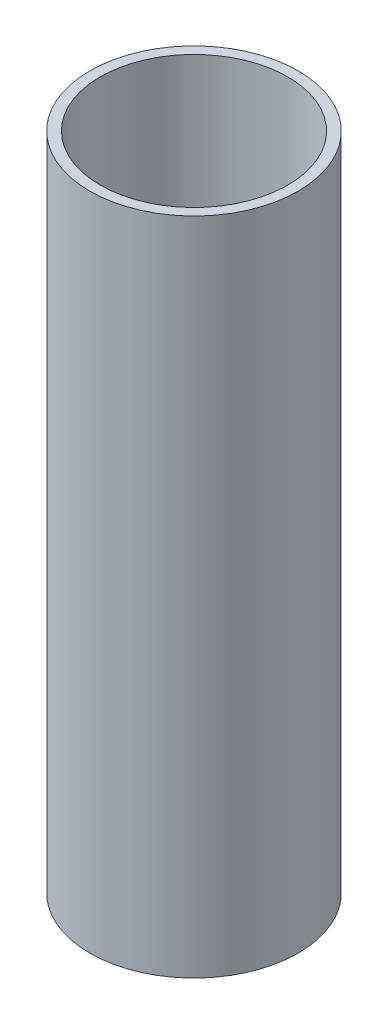
ISO-10303-21;
HEADER;
FILE_DESCRIPTION(('STEP AP214'),'2;1');
FILE_NAME('part.step','',(''),(''),'','','');
FILE_SCHEMA(('AUTOMOTIVE_DESIGN { 1 0 10303 214 1 1 1 1 }'));
ENDSEC;
DATA;
#1=APPLICATION_CONTEXT('core data for automotive mechanical design processes');
#2=APPLICATION_PROTOCOL_DEFINITION('international standard','automotive_design',2000,#1);
#3=PRODUCT_CONTEXT('',#1,'mechanical');
#4=PRODUCT('Part','Part','',(#3));
#5=PRODUCT_RELATED_PRODUCT_CATEGORY('part','',(#4));
#6=PRODUCT_DEFINITION_FORMATION('','',#4);
#7=PRODUCT_DEFINITION_CONTEXT('part definition',#1,'design');
#8=PRODUCT_DEFINITION('design','',#6,#7);
#9=PRODUCT_DEFINITION_SHAPE('','',#8);
#10=(LENGTH_UNIT() NAMED_UNIT(*) SI_UNIT(.MILLI.,.METRE.));
#11=(NAMED_UNIT(*) PLANE_ANGLE_UNIT() SI_UNIT($,.RADIAN.));
#12=(NAMED_UNIT(*) SI_UNIT($,.STERADIAN.) SOLID_ANGLE_UNIT());
#13=UNCERTAINTY_MEASURE_WITH_UNIT(LENGTH_MEASURE(1.E-05),#10,'distance_accuracy_value','');
#14=(GEOMETRIC_REPRESENTATION_CONTEXT(3) GLOBAL_UNCERTAINTY_ASSIGNED_CONTEXT((#13)) GLOBAL_UNIT_ASSIGNED_CONTEXT((#10,
#11,#12)) REPRESENTATION_CONTEXT('',''));
#15=CARTESIAN_POINT('',(0.,0.,0.));
#16=DIRECTION('',(0.,0.,1.));
#17=DIRECTION('',(1.,0.,0.));
#18=AXIS2_PLACEMENT_3D('',#15,#16,#17);
#19=CARTESIAN_POINT('',(0.,190.,0.));
#20=DIRECTION('',(0.,1.,0.));
#21=DIRECTION('',(0.,0.,1.));
#22=AXIS2_PLACEMENT_3D('',#19,#20,#21);
#23=PLANE('',#22);
#24=CARTESIAN_POINT('',(0.,190.,0.));
#25=DIRECTION('',(0.,1.,0.));
#26=DIRECTION('',(0.,0.,1.));
#27=AXIS2_PLACEMENT_3D('',#24,#25,#26);
#28=CIRCLE('',#27,30.);
#29=CARTESIAN_POINT('',(0.,190.,30.));
#30=VERTEX_POINT('',#29);
#31=EDGE_CURVE('E10',#30,#30,#28,.T.);
#32=ORIENTED_EDGE('',*,*,#31,.T.);
#33=EDGE_LOOP('',(#32));
#34=FACE_BOUND('',#33,.T.);
#35=CARTESIAN_POINT('',(0.,190.,0.));
#36=DIRECTION('',(0.,1.,0.));
#37=DIRECTION('',(0.,0.,1.));
#38=AXIS2_PLACEMENT_3D('',#35,#36,#37);
#39=CIRCLE('',#38,27.);
#40=CARTESIAN_POINT('',(0.,190.,27.));
#41=VERTEX_POINT('',#40);
#42=EDGE_CURVE('E46',#41,#41,#39,.T.);
#43=ORIENTED_EDGE('',*,*,#42,.F.);
#44=EDGE_LOOP('',(#43));
#45=FACE_BOUND('',#44,.T.);
#46=ADVANCED_FACE('F35',(#34,#45),#23,.T.);
#47=CARTESIAN_POINT('',(0.,0.,0.));
#48=DIRECTION('',(0.,1.,0.));
#49=DIRECTION('',(0.,0.,1.));
#50=AXIS2_PLACEMENT_3D('',#47,#48,#49);
#51=PLANE('',#50);
#52=CARTESIAN_POINT('',(0.,0.,0.));
#53=DIRECTION('',(0.,1.,0.));
#54=DIRECTION('',(0.,0.,1.));
#55=AXIS2_PLACEMENT_3D('',#52,#53,#54);
#56=CIRCLE('',#55,30.);
#57=CARTESIAN_POINT('',(0.,0.,30.));
#58=VERTEX_POINT('',#57);
#59=EDGE_CURVE('E39',#58,#58,#56,.T.);
#60=ORIENTED_EDGE('',*,*,#59,.F.);
#61=EDGE_LOOP('',(#60));
#62=FACE_BOUND('',#61,.T.);
#63=CARTESIAN_POINT('',(0.,0.,0.));
#64=DIRECTION('',(0.,1.,0.));
#65=DIRECTION('',(0.,0.,1.));
#66=AXIS2_PLACEMENT_3D('',#63,#64,#65);
#67=CIRCLE('',#66,27.);
#68=CARTESIAN_POINT('',(0.,0.,27.));
#69=VERTEX_POINT('',#68);
#70=EDGE_CURVE('E48',#69,#69,#67,.T.);
#71=ORIENTED_EDGE('',*,*,#70,.T.);
#72=EDGE_LOOP('',(#71));
#73=FACE_BOUND('',#72,.T.);
#74=ADVANCED_FACE('F58',(#62,#73),#51,.F.);
#75=CARTESIAN_POINT('',(0.,190.,0.));
#76=DIRECTION('',(0.,-1.,0.));
#77=DIRECTION('',(0.,0.,-1.));
#78=AXIS2_PLACEMENT_3D('',#75,#76,#77);
#79=CYLINDRICAL_SURFACE('',#78,30.);
#80=ORIENTED_EDGE('',*,*,#31,.F.);
#81=EDGE_LOOP('',(#80));
#82=FACE_BOUND('',#81,.T.);
#83=ORIENTED_EDGE('',*,*,#59,.T.);
#84=EDGE_LOOP('',(#83));
#85=FACE_BOUND('',#84,.T.);
#86=ADVANCED_FACE('F37',(#82,#85),#79,.T.);
#87=CARTESIAN_POINT('',(0.,190.,0.));
#88=DIRECTION('',(0.,-1.,0.));
#89=DIRECTION('',(0.,0.,-1.));
#90=AXIS2_PLACEMENT_3D('',#87,#88,#89);
#91=CYLINDRICAL_SURFACE('',#90,27.);
#92=ORIENTED_EDGE('',*,*,#42,.T.);
#93=EDGE_LOOP('',(#92));
#94=FACE_BOUND('',#93,.T.);
#95=ORIENTED_EDGE('',*,*,#70,.F.);
#96=EDGE_LOOP('',(#95));
#97=FACE_BOUND('',#96,.T.);
#98=ADVANCED_FACE('F54',(#94,#97),#91,.F.);
#99=CLOSED_SHELL('',(#46,#74,#86,#98));
#100=MANIFOLD_SOLID_BREP('B2',#99);
#101=ADVANCED_BREP_SHAPE_REPRESENTATION('',(#18,#100),#14);
#102=SHAPE_DEFINITION_REPRESENTATION(#9,#101);
ENDSEC;
END-ISO-10303-21;
